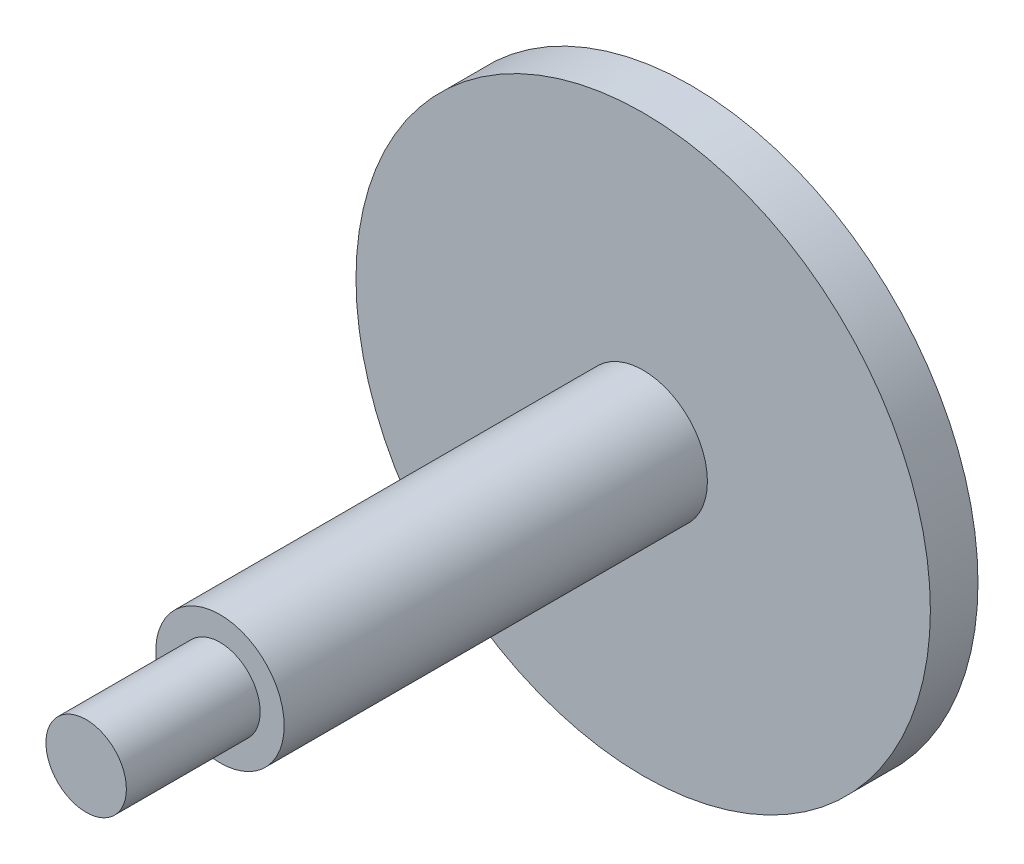
ISO-10303-21;
HEADER;
FILE_DESCRIPTION(('STEP AP214'),'2;1');
FILE_NAME('part.step','',(''),(''),'','','');
FILE_SCHEMA(('AUTOMOTIVE_DESIGN { 1 0 10303 214 1 1 1 1 }'));
ENDSEC;
DATA;
#1=APPLICATION_CONTEXT('core data for automotive mechanical design processes');
#2=APPLICATION_PROTOCOL_DEFINITION('international standard','automotive_design',2000,#1);
#3=PRODUCT_CONTEXT('',#1,'mechanical');
#4=PRODUCT('Part','Part','',(#3));
#5=PRODUCT_RELATED_PRODUCT_CATEGORY('part','',(#4));
#6=PRODUCT_DEFINITION_FORMATION('','',#4);
#7=PRODUCT_DEFINITION_CONTEXT('part definition',#1,'design');
#8=PRODUCT_DEFINITION('design','',#6,#7);
#9=PRODUCT_DEFINITION_SHAPE('','',#8);
#10=(LENGTH_UNIT() NAMED_UNIT(*) SI_UNIT(.MILLI.,.METRE.));
#11=(NAMED_UNIT(*) PLANE_ANGLE_UNIT() SI_UNIT($,.RADIAN.));
#12=(NAMED_UNIT(*) SI_UNIT($,.STERADIAN.) SOLID_ANGLE_UNIT());
#13=UNCERTAINTY_MEASURE_WITH_UNIT(LENGTH_MEASURE(1.E-05),#10,'distance_accuracy_value','');
#14=(GEOMETRIC_REPRESENTATION_CONTEXT(3) GLOBAL_UNCERTAINTY_ASSIGNED_CONTEXT((#13)) GLOBAL_UNIT_ASSIGNED_CONTEXT((#10,
#11,#12)) REPRESENTATION_CONTEXT('',''));
#15=CARTESIAN_POINT('',(0.,0.,0.));
#16=DIRECTION('',(0.,0.,1.));
#17=DIRECTION('',(1.,0.,0.));
#18=AXIS2_PLACEMENT_3D('',#15,#16,#17);
#19=CARTESIAN_POINT('',(0.,0.,127.));
#20=DIRECTION('',(0.,0.,-1.));
#21=DIRECTION('',(-1.,0.,0.));
#22=AXIS2_PLACEMENT_3D('',#19,#20,#21);
#23=CYLINDRICAL_SURFACE('',#22,13.49375);
#24=CARTESIAN_POINT('',(0.,0.,10.));
#25=DIRECTION('',(0.,0.,1.));
#26=DIRECTION('',(1.,0.,0.));
#27=AXIS2_PLACEMENT_3D('',#24,#25,#26);
#28=CIRCLE('',#27,13.49375);
#29=CARTESIAN_POINT('',(13.49375,0.,10.));
#30=VERTEX_POINT('',#29);
#31=EDGE_CURVE('E47',#30,#30,#28,.T.);
#32=ORIENTED_EDGE('',*,*,#31,.T.);
#33=EDGE_LOOP('',(#32));
#34=FACE_BOUND('',#33,.T.);
#35=CARTESIAN_POINT('',(0.,0.,98.9));
#36=DIRECTION('',(0.,0.,1.));
#37=DIRECTION('',(1.,0.,0.));
#38=AXIS2_PLACEMENT_3D('',#35,#36,#37);
#39=CIRCLE('',#38,13.49375);
#40=CARTESIAN_POINT('',(13.49375,0.,98.9));
#41=VERTEX_POINT('',#40);
#42=EDGE_CURVE('E57',#41,#41,#39,.T.);
#43=ORIENTED_EDGE('',*,*,#42,.F.);
#44=EDGE_LOOP('',(#43));
#45=FACE_BOUND('',#44,.T.);
#46=ADVANCED_FACE('F39',(#34,#45),#23,.T.);
#47=CARTESIAN_POINT('',(0.,0.,10.));
#48=DIRECTION('',(0.,0.,-1.));
#49=DIRECTION('',(-1.,0.,0.));
#50=AXIS2_PLACEMENT_3D('',#47,#48,#49);
#51=CYLINDRICAL_SURFACE('',#50,60.325);
#52=CARTESIAN_POINT('',(0.,0.,10.));
#53=DIRECTION('',(0.,0.,1.));
#54=DIRECTION('',(1.,0.,0.));
#55=AXIS2_PLACEMENT_3D('',#52,#53,#54);
#56=CIRCLE('',#55,60.325);
#57=CARTESIAN_POINT('',(60.325,0.,10.));
#58=VERTEX_POINT('',#57);
#59=EDGE_CURVE('E52',#58,#58,#56,.T.);
#60=ORIENTED_EDGE('',*,*,#59,.F.);
#61=EDGE_LOOP('',(#60));
#62=FACE_BOUND('',#61,.T.);
#63=CARTESIAN_POINT('',(0.,0.,0.));
#64=DIRECTION('',(0.,0.,1.));
#65=DIRECTION('',(1.,0.,0.));
#66=AXIS2_PLACEMENT_3D('',#63,#64,#65);
#67=CIRCLE('',#66,60.325);
#68=CARTESIAN_POINT('',(60.325,0.,0.));
#69=VERTEX_POINT('',#68);
#70=EDGE_CURVE('E43',#69,#69,#67,.T.);
#71=ORIENTED_EDGE('',*,*,#70,.T.);
#72=EDGE_LOOP('',(#71));
#73=FACE_BOUND('',#72,.T.);
#74=ADVANCED_FACE('F41',(#62,#73),#51,.T.);
#75=CARTESIAN_POINT('',(0.,0.,10.));
#76=DIRECTION('',(0.,0.,1.));
#77=DIRECTION('',(1.,0.,0.));
#78=AXIS2_PLACEMENT_3D('',#75,#76,#77);
#79=PLANE('',#78);
#80=ORIENTED_EDGE('',*,*,#31,.F.);
#81=EDGE_LOOP('',(#80));
#82=FACE_BOUND('',#81,.T.);
#83=ORIENTED_EDGE('',*,*,#59,.T.);
#84=EDGE_LOOP('',(#83));
#85=FACE_BOUND('',#84,.T.);
#86=ADVANCED_FACE('F69',(#82,#85),#79,.T.);
#87=CARTESIAN_POINT('',(0.,0.,0.));
#88=DIRECTION('',(0.,0.,1.));
#89=DIRECTION('',(1.,0.,0.));
#90=AXIS2_PLACEMENT_3D('',#87,#88,#89);
#91=PLANE('',#90);
#92=ORIENTED_EDGE('',*,*,#70,.F.);
#93=EDGE_LOOP('',(#92));
#94=FACE_BOUND('',#93,.T.);
#95=ADVANCED_FACE('F66',(#94),#91,.F.);
#96=CARTESIAN_POINT('',(0.,0.,98.9));
#97=DIRECTION('',(0.,0.,1.));
#98=DIRECTION('',(1.,0.,0.));
#99=AXIS2_PLACEMENT_3D('',#96,#97,#98);
#100=PLANE('',#99);
#101=CARTESIAN_POINT('',(0.,0.,98.9));
#102=DIRECTION('',(0.,0.,1.));
#103=DIRECTION('',(1.,0.,0.));
#104=AXIS2_PLACEMENT_3D('',#101,#102,#103);
#105=CIRCLE('',#104,8.44906303883472);
#106=CARTESIAN_POINT('',(8.44906303883472,0.,98.9));
#107=VERTEX_POINT('',#106);
#108=EDGE_CURVE('E10',#107,#107,#105,.T.);
#109=ORIENTED_EDGE('',*,*,#108,.F.);
#110=EDGE_LOOP('',(#109));
#111=FACE_BOUND('',#110,.T.);
#112=ORIENTED_EDGE('',*,*,#42,.T.);
#113=EDGE_LOOP('',(#112));
#114=FACE_BOUND('',#113,.T.);
#115=ADVANCED_FACE('F68',(#111,#114),#100,.T.);
#116=CARTESIAN_POINT('',(0.,0.,127.));
#117=DIRECTION('',(0.,0.,-1.));
#118=DIRECTION('',(-1.,0.,0.));
#119=AXIS2_PLACEMENT_3D('',#116,#117,#118);
#120=CYLINDRICAL_SURFACE('',#119,8.44906303883472);
#121=CARTESIAN_POINT('',(0.,0.,127.));
#122=DIRECTION('',(0.,0.,1.));
#123=DIRECTION('',(1.,0.,0.));
#124=AXIS2_PLACEMENT_3D('',#121,#122,#123);
#125=CIRCLE('',#124,8.44906303883472);
#126=CARTESIAN_POINT('',(8.44906303883472,0.,127.));
#127=VERTEX_POINT('',#126);
#128=EDGE_CURVE('E56',#127,#127,#125,.T.);
#129=ORIENTED_EDGE('',*,*,#128,.F.);
#130=EDGE_LOOP('',(#129));
#131=FACE_BOUND('',#130,.T.);
#132=ORIENTED_EDGE('',*,*,#108,.T.);
#133=EDGE_LOOP('',(#132));
#134=FACE_BOUND('',#133,.T.);
#135=ADVANCED_FACE('F75',(#131,#134),#120,.T.);
#136=CARTESIAN_POINT('',(0.,0.,127.));
#137=DIRECTION('',(0.,0.,1.));
#138=DIRECTION('',(1.,0.,0.));
#139=AXIS2_PLACEMENT_3D('',#136,#137,#138);
#140=PLANE('',#139);
#141=ORIENTED_EDGE('',*,*,#128,.T.);
#142=EDGE_LOOP('',(#141));
#143=FACE_BOUND('',#142,.T.);
#144=ADVANCED_FACE('F93',(#143),#140,.T.);
#145=CLOSED_SHELL('',(#46,#74,#86,#95,#115,#135,#144));
#146=MANIFOLD_SOLID_BREP('B2',#145);
#147=ADVANCED_BREP_SHAPE_REPRESENTATION('',(#18,#146),#14);
#148=SHAPE_DEFINITION_REPRESENTATION(#9,#147);
ENDSEC;
END-ISO-10303-21;
